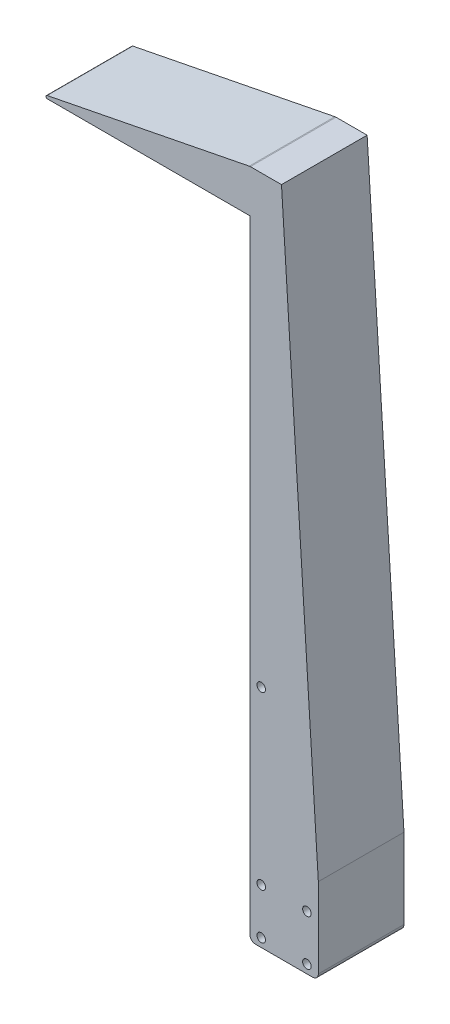
ISO-10303-21;
HEADER;
FILE_DESCRIPTION(('STEP AP214'),'2;1');
FILE_NAME('part.step','',(''),(''),'','','');
FILE_SCHEMA(('AUTOMOTIVE_DESIGN { 1 0 10303 214 1 1 1 1 }'));
ENDSEC;
DATA;
#1=APPLICATION_CONTEXT('core data for automotive mechanical design processes');
#2=APPLICATION_PROTOCOL_DEFINITION('international standard','automotive_design',2000,#1);
#3=PRODUCT_CONTEXT('',#1,'mechanical');
#4=PRODUCT('Part','Part','',(#3));
#5=PRODUCT_RELATED_PRODUCT_CATEGORY('part','',(#4));
#6=PRODUCT_DEFINITION_FORMATION('','',#4);
#7=PRODUCT_DEFINITION_CONTEXT('part definition',#1,'design');
#8=PRODUCT_DEFINITION('design','',#6,#7);
#9=PRODUCT_DEFINITION_SHAPE('','',#8);
#10=(LENGTH_UNIT() NAMED_UNIT(*) SI_UNIT(.MILLI.,.METRE.));
#11=(NAMED_UNIT(*) PLANE_ANGLE_UNIT() SI_UNIT($,.RADIAN.));
#12=(NAMED_UNIT(*) SI_UNIT($,.STERADIAN.) SOLID_ANGLE_UNIT());
#13=UNCERTAINTY_MEASURE_WITH_UNIT(LENGTH_MEASURE(1.E-05),#10,'distance_accuracy_value','');
#14=(GEOMETRIC_REPRESENTATION_CONTEXT(3) GLOBAL_UNCERTAINTY_ASSIGNED_CONTEXT((#13)) GLOBAL_UNIT_ASSIGNED_CONTEXT((#10,
#11,#12)) REPRESENTATION_CONTEXT('',''));
#15=CARTESIAN_POINT('',(0.,0.,0.));
#16=DIRECTION('',(0.,0.,1.));
#17=DIRECTION('',(1.,0.,0.));
#18=AXIS2_PLACEMENT_3D('',#15,#16,#17);
#19=CARTESIAN_POINT('',(22.,233.,30.));
#20=DIRECTION('',(0.,0.,1.));
#21=DIRECTION('',(1.,0.,0.));
#22=AXIS2_PLACEMENT_3D('',#19,#20,#21);
#23=PLANE('',#22);
#24=CARTESIAN_POINT('',(3.99999999999996,78.9999999999997,30.));
#25=DIRECTION('',(0.,0.,-1.));
#26=DIRECTION('',(-1.,0.,0.));
#27=AXIS2_PLACEMENT_3D('',#24,#25,#26);
#28=CIRCLE('',#27,1.5);
#29=CARTESIAN_POINT('',(2.49999999999996,78.9999999999997,30.));
#30=VERTEX_POINT('',#29);
#31=EDGE_CURVE('E258',#30,#30,#28,.T.);
#32=ORIENTED_EDGE('',*,*,#31,.T.);
#33=EDGE_LOOP('',(#32));
#34=FACE_BOUND('',#33,.T.);
#35=CARTESIAN_POINT('',(19.9999999999999,19.,30.));
#36=DIRECTION('',(0.,0.,1.));
#37=DIRECTION('',(1.,0.,0.));
#38=AXIS2_PLACEMENT_3D('',#35,#36,#37);
#39=CIRCLE('',#38,1.5);
#40=CARTESIAN_POINT('',(21.4999999999999,19.,30.));
#41=VERTEX_POINT('',#40);
#42=EDGE_CURVE('E242',#41,#41,#39,.T.);
#43=ORIENTED_EDGE('',*,*,#42,.F.);
#44=EDGE_LOOP('',(#43));
#45=FACE_BOUND('',#44,.T.);
#46=CARTESIAN_POINT('',(4.,2.99999999999989,30.));
#47=DIRECTION('',(0.,0.,1.));
#48=DIRECTION('',(1.,0.,0.));
#49=AXIS2_PLACEMENT_3D('',#46,#47,#48);
#50=CIRCLE('',#49,1.5);
#51=CARTESIAN_POINT('',(5.5,2.99999999999989,30.));
#52=VERTEX_POINT('',#51);
#53=EDGE_CURVE('E227',#52,#52,#50,.T.);
#54=ORIENTED_EDGE('',*,*,#53,.F.);
#55=EDGE_LOOP('',(#54));
#56=FACE_BOUND('',#55,.T.);
#57=CARTESIAN_POINT('',(20.,3.,30.));
#58=DIRECTION('',(0.,0.,1.));
#59=DIRECTION('',(1.,0.,0.));
#60=AXIS2_PLACEMENT_3D('',#57,#58,#59);
#61=CIRCLE('',#60,1.5);
#62=CARTESIAN_POINT('',(21.5,3.,30.));
#63=VERTEX_POINT('',#62);
#64=EDGE_CURVE('E161',#63,#63,#61,.T.);
#65=ORIENTED_EDGE('',*,*,#64,.F.);
#66=EDGE_LOOP('',(#65));
#67=FACE_BOUND('',#66,.T.);
#68=CARTESIAN_POINT('',(3.99999999999994,18.9999999999999,30.));
#69=DIRECTION('',(0.,0.,1.));
#70=DIRECTION('',(1.,0.,0.));
#71=AXIS2_PLACEMENT_3D('',#68,#69,#70);
#72=CIRCLE('',#71,1.5);
#73=CARTESIAN_POINT('',(5.49999999999995,18.9999999999999,30.));
#74=VERTEX_POINT('',#73);
#75=EDGE_CURVE('E231',#74,#74,#72,.T.);
#76=ORIENTED_EDGE('',*,*,#75,.F.);
#77=EDGE_LOOP('',(#76));
#78=FACE_BOUND('',#77,.T.);
#79=DIRECTION('',(0.,1.,0.));
#80=VECTOR('',#79,1.);
#81=CARTESIAN_POINT('',(24.,220.,30.));
#82=LINE('',#81,#80);
#83=CARTESIAN_POINT('',(24.,2.00000000000001,30.));
#84=VERTEX_POINT('',#83);
#85=CARTESIAN_POINT('',(24.,30.,30.));
#86=VERTEX_POINT('',#85);
#87=EDGE_CURVE('E65',#84,#86,#82,.T.);
#88=ORIENTED_EDGE('',*,*,#87,.T.);
#89=DIRECTION('',(-0.0628135619036731,0.998025278457902,0.));
#90=VECTOR('',#89,1.);
#91=CARTESIAN_POINT('',(24.,30.,30.));
#92=LINE('',#91,#90);
#93=CARTESIAN_POINT('',(11.0977414418305,235.,30.));
#94=VERTEX_POINT('',#93);
#95=EDGE_CURVE('E57',#86,#94,#92,.T.);
#96=ORIENTED_EDGE('',*,*,#95,.T.);
#97=DIRECTION('',(-1.,0.,0.));
#98=VECTOR('',#97,1.);
#99=CARTESIAN_POINT('',(22.,235.,30.));
#100=LINE('',#99,#98);
#101=CARTESIAN_POINT('',(0.195482883660973,235.,30.));
#102=VERTEX_POINT('',#101);
#103=EDGE_CURVE('E108',#94,#102,#100,.T.);
#104=ORIENTED_EDGE('',*,*,#103,.T.);
#105=CARTESIAN_POINT('',(0.195482883660966,233.,30.));
#106=DIRECTION('',(0.,0.,1.));
#107=DIRECTION('',(-1.,0.,0.));
#108=AXIS2_PLACEMENT_3D('',#105,#106,#107);
#109=CIRCLE('',#108,2.);
#110=CARTESIAN_POINT('',(-0.191783180132361,234.962148056553,30.));
#111=VERTEX_POINT('',#110);
#112=EDGE_CURVE('E222',#102,#111,#109,.T.);
#113=ORIENTED_EDGE('',*,*,#112,.T.);
#114=DIRECTION('',(-0.981074028276412,-0.19363303189666,0.));
#115=VECTOR('',#114,1.);
#116=CARTESIAN_POINT('',(-0.191783180132361,234.962148056553,30.));
#117=LINE('',#116,#115);
#118=CARTESIAN_POINT('',(-70.9812791283662,220.990537014138,30.));
#119=VERTEX_POINT('',#118);
#120=EDGE_CURVE('E198',#111,#119,#117,.T.);
#121=ORIENTED_EDGE('',*,*,#120,.T.);
#122=CARTESIAN_POINT('',(-70.8844626124181,220.5,30.));
#123=DIRECTION('',(0.,0.,1.));
#124=DIRECTION('',(-1.,0.,0.));
#125=AXIS2_PLACEMENT_3D('',#122,#123,#124);
#126=CIRCLE('',#125,0.499999999999995);
#127=CARTESIAN_POINT('',(-70.8844626124179,220.,30.));
#128=VERTEX_POINT('',#127);
#129=EDGE_CURVE('E216',#119,#128,#126,.T.);
#130=ORIENTED_EDGE('',*,*,#129,.T.);
#131=DIRECTION('',(1.,0.,0.));
#132=VECTOR('',#131,1.);
#133=CARTESIAN_POINT('',(0.,220.,30.));
#134=LINE('',#133,#132);
#135=CARTESIAN_POINT('',(0.,220.,30.));
#136=VERTEX_POINT('',#135);
#137=EDGE_CURVE('E214',#128,#136,#134,.T.);
#138=ORIENTED_EDGE('',*,*,#137,.T.);
#139=DIRECTION('',(0.,-1.,0.));
#140=VECTOR('',#139,1.);
#141=CARTESIAN_POINT('',(0.,2.00000000000001,30.));
#142=LINE('',#141,#140);
#143=CARTESIAN_POINT('',(0.,2.,30.));
#144=VERTEX_POINT('',#143);
#145=EDGE_CURVE('E131',#136,#144,#142,.T.);
#146=ORIENTED_EDGE('',*,*,#145,.T.);
#147=CARTESIAN_POINT('',(2.,2.,30.));
#148=DIRECTION('',(0.,0.,1.));
#149=DIRECTION('',(-1.,0.,0.));
#150=AXIS2_PLACEMENT_3D('',#147,#148,#149);
#151=CIRCLE('',#150,2.);
#152=CARTESIAN_POINT('',(2.00000000000001,0.,30.));
#153=VERTEX_POINT('',#152);
#154=EDGE_CURVE('E129',#144,#153,#151,.T.);
#155=ORIENTED_EDGE('',*,*,#154,.T.);
#156=DIRECTION('',(1.,0.,0.));
#157=VECTOR('',#156,1.);
#158=CARTESIAN_POINT('',(2.00000000000001,0.,30.));
#159=LINE('',#158,#157);
#160=CARTESIAN_POINT('',(22.,0.,30.));
#161=VERTEX_POINT('',#160);
#162=EDGE_CURVE('E134',#153,#161,#159,.T.);
#163=ORIENTED_EDGE('',*,*,#162,.T.);
#164=CARTESIAN_POINT('',(22.,2.,30.));
#165=DIRECTION('',(0.,0.,1.));
#166=DIRECTION('',(1.,0.,0.));
#167=AXIS2_PLACEMENT_3D('',#164,#165,#166);
#168=CIRCLE('',#167,2.);
#169=EDGE_CURVE('E155',#161,#84,#168,.T.);
#170=ORIENTED_EDGE('',*,*,#169,.T.);
#171=EDGE_LOOP('',(#88,#96,#104,#113,#121,#130,#138,#146,#155,#163,#170));
#172=FACE_BOUND('',#171,.T.);
#173=ADVANCED_FACE('F41',(#34,#45,#56,#67,#78,#172),#23,.T.);
#174=CARTESIAN_POINT('',(22.,233.,0.));
#175=DIRECTION('',(0.,0.,1.));
#176=DIRECTION('',(1.,0.,0.));
#177=AXIS2_PLACEMENT_3D('',#174,#175,#176);
#178=PLANE('',#177);
#179=CARTESIAN_POINT('',(3.99999999999996,78.9999999999997,0.));
#180=DIRECTION('',(0.,0.,-1.));
#181=DIRECTION('',(-1.,0.,0.));
#182=AXIS2_PLACEMENT_3D('',#179,#180,#181);
#183=CIRCLE('',#182,1.5);
#184=CARTESIAN_POINT('',(2.49999999999996,78.9999999999997,0.));
#185=VERTEX_POINT('',#184);
#186=EDGE_CURVE('E256',#185,#185,#183,.T.);
#187=ORIENTED_EDGE('',*,*,#186,.F.);
#188=EDGE_LOOP('',(#187));
#189=FACE_BOUND('',#188,.T.);
#190=CARTESIAN_POINT('',(3.99999999999994,18.9999999999999,0.));
#191=DIRECTION('',(0.,0.,1.));
#192=DIRECTION('',(1.,0.,0.));
#193=AXIS2_PLACEMENT_3D('',#190,#191,#192);
#194=CIRCLE('',#193,1.5);
#195=CARTESIAN_POINT('',(5.49999999999995,18.9999999999999,0.));
#196=VERTEX_POINT('',#195);
#197=EDGE_CURVE('E240',#196,#196,#194,.T.);
#198=ORIENTED_EDGE('',*,*,#197,.T.);
#199=EDGE_LOOP('',(#198));
#200=FACE_BOUND('',#199,.T.);
#201=CARTESIAN_POINT('',(4.,2.99999999999989,0.));
#202=DIRECTION('',(0.,0.,1.));
#203=DIRECTION('',(1.,0.,0.));
#204=AXIS2_PLACEMENT_3D('',#201,#202,#203);
#205=CIRCLE('',#204,1.5);
#206=CARTESIAN_POINT('',(5.5,2.99999999999989,0.));
#207=VERTEX_POINT('',#206);
#208=EDGE_CURVE('E232',#207,#207,#205,.T.);
#209=ORIENTED_EDGE('',*,*,#208,.T.);
#210=EDGE_LOOP('',(#209));
#211=FACE_BOUND('',#210,.T.);
#212=CARTESIAN_POINT('',(20.,3.,0.));
#213=DIRECTION('',(0.,0.,1.));
#214=DIRECTION('',(1.,0.,0.));
#215=AXIS2_PLACEMENT_3D('',#212,#213,#214);
#216=CIRCLE('',#215,1.5);
#217=CARTESIAN_POINT('',(21.5,3.,0.));
#218=VERTEX_POINT('',#217);
#219=EDGE_CURVE('E223',#218,#218,#216,.T.);
#220=ORIENTED_EDGE('',*,*,#219,.T.);
#221=EDGE_LOOP('',(#220));
#222=FACE_BOUND('',#221,.T.);
#223=CARTESIAN_POINT('',(19.9999999999999,19.,0.));
#224=DIRECTION('',(0.,0.,1.));
#225=DIRECTION('',(1.,0.,0.));
#226=AXIS2_PLACEMENT_3D('',#223,#224,#225);
#227=CIRCLE('',#226,1.5);
#228=CARTESIAN_POINT('',(21.4999999999999,19.,0.));
#229=VERTEX_POINT('',#228);
#230=EDGE_CURVE('E238',#229,#229,#227,.T.);
#231=ORIENTED_EDGE('',*,*,#230,.T.);
#232=EDGE_LOOP('',(#231));
#233=FACE_BOUND('',#232,.T.);
#234=DIRECTION('',(-0.0628135619036731,0.998025278457902,0.));
#235=VECTOR('',#234,1.);
#236=CARTESIAN_POINT('',(24.,30.,0.));
#237=LINE('',#236,#235);
#238=CARTESIAN_POINT('',(24.,30.,0.));
#239=VERTEX_POINT('',#238);
#240=CARTESIAN_POINT('',(11.0977414418305,235.,0.));
#241=VERTEX_POINT('',#240);
#242=EDGE_CURVE('E251',#239,#241,#237,.T.);
#243=ORIENTED_EDGE('',*,*,#242,.F.);
#244=DIRECTION('',(0.,1.,0.));
#245=VECTOR('',#244,1.);
#246=CARTESIAN_POINT('',(24.,2.00000000000001,0.));
#247=LINE('',#246,#245);
#248=CARTESIAN_POINT('',(24.,2.00000000000001,0.));
#249=VERTEX_POINT('',#248);
#250=EDGE_CURVE('E171',#249,#239,#247,.T.);
#251=ORIENTED_EDGE('',*,*,#250,.F.);
#252=CARTESIAN_POINT('',(22.,2.,0.));
#253=DIRECTION('',(0.,0.,1.));
#254=DIRECTION('',(1.,0.,0.));
#255=AXIS2_PLACEMENT_3D('',#252,#253,#254);
#256=CIRCLE('',#255,2.);
#257=CARTESIAN_POINT('',(22.,0.,0.));
#258=VERTEX_POINT('',#257);
#259=EDGE_CURVE('E105',#258,#249,#256,.T.);
#260=ORIENTED_EDGE('',*,*,#259,.F.);
#261=DIRECTION('',(1.,0.,0.));
#262=VECTOR('',#261,1.);
#263=CARTESIAN_POINT('',(2.00000000000001,0.,0.));
#264=LINE('',#263,#262);
#265=CARTESIAN_POINT('',(2.00000000000001,0.,0.));
#266=VERTEX_POINT('',#265);
#267=EDGE_CURVE('E174',#266,#258,#264,.T.);
#268=ORIENTED_EDGE('',*,*,#267,.F.);
#269=CARTESIAN_POINT('',(2.,2.,0.));
#270=DIRECTION('',(0.,0.,1.));
#271=DIRECTION('',(-1.,0.,0.));
#272=AXIS2_PLACEMENT_3D('',#269,#270,#271);
#273=CIRCLE('',#272,2.);
#274=CARTESIAN_POINT('',(0.,2.,0.));
#275=VERTEX_POINT('',#274);
#276=EDGE_CURVE('E145',#275,#266,#273,.T.);
#277=ORIENTED_EDGE('',*,*,#276,.F.);
#278=DIRECTION('',(0.,-1.,0.));
#279=VECTOR('',#278,1.);
#280=CARTESIAN_POINT('',(0.,2.00000000000001,0.));
#281=LINE('',#280,#279);
#282=CARTESIAN_POINT('',(0.,220.,0.));
#283=VERTEX_POINT('',#282);
#284=EDGE_CURVE('E166',#283,#275,#281,.T.);
#285=ORIENTED_EDGE('',*,*,#284,.F.);
#286=DIRECTION('',(1.,0.,0.));
#287=VECTOR('',#286,1.);
#288=CARTESIAN_POINT('',(0.,220.,0.));
#289=LINE('',#288,#287);
#290=CARTESIAN_POINT('',(-70.8844626124179,220.,0.));
#291=VERTEX_POINT('',#290);
#292=EDGE_CURVE('E170',#291,#283,#289,.T.);
#293=ORIENTED_EDGE('',*,*,#292,.F.);
#294=CARTESIAN_POINT('',(-70.8844626124181,220.5,0.));
#295=DIRECTION('',(0.,0.,1.));
#296=DIRECTION('',(-1.,0.,0.));
#297=AXIS2_PLACEMENT_3D('',#294,#295,#296);
#298=CIRCLE('',#297,0.499999999999995);
#299=CARTESIAN_POINT('',(-70.9812791283662,220.990537014138,0.));
#300=VERTEX_POINT('',#299);
#301=EDGE_CURVE('E164',#300,#291,#298,.T.);
#302=ORIENTED_EDGE('',*,*,#301,.F.);
#303=DIRECTION('',(-0.981074028276412,-0.19363303189666,0.));
#304=VECTOR('',#303,1.);
#305=CARTESIAN_POINT('',(-0.191783180132361,234.962148056553,0.));
#306=LINE('',#305,#304);
#307=CARTESIAN_POINT('',(-0.191783180132361,234.962148056553,0.));
#308=VERTEX_POINT('',#307);
#309=EDGE_CURVE('E162',#308,#300,#306,.T.);
#310=ORIENTED_EDGE('',*,*,#309,.F.);
#311=CARTESIAN_POINT('',(0.195482883660966,233.,0.));
#312=DIRECTION('',(0.,0.,1.));
#313=DIRECTION('',(-1.,0.,0.));
#314=AXIS2_PLACEMENT_3D('',#311,#312,#313);
#315=CIRCLE('',#314,2.);
#316=CARTESIAN_POINT('',(0.195482883660973,235.,0.));
#317=VERTEX_POINT('',#316);
#318=EDGE_CURVE('E159',#317,#308,#315,.T.);
#319=ORIENTED_EDGE('',*,*,#318,.F.);
#320=DIRECTION('',(-1.,0.,0.));
#321=VECTOR('',#320,1.);
#322=CARTESIAN_POINT('',(22.,235.,0.));
#323=LINE('',#322,#321);
#324=EDGE_CURVE('E158',#241,#317,#323,.T.);
#325=ORIENTED_EDGE('',*,*,#324,.F.);
#326=EDGE_LOOP('',(#243,#251,#260,#268,#277,#285,#293,#302,#310,#319,#325));
#327=FACE_BOUND('',#326,.T.);
#328=ADVANCED_FACE('F201',(#189,#200,#211,#222,#233,#327),#178,.F.);
#329=CARTESIAN_POINT('',(22.,235.,30.));
#330=DIRECTION('',(0.,-1.,0.));
#331=DIRECTION('',(0.,0.,-1.));
#332=AXIS2_PLACEMENT_3D('',#329,#330,#331);
#333=PLANE('',#332);
#334=ORIENTED_EDGE('',*,*,#103,.F.);
#335=DIRECTION('',(0.,0.,-1.));
#336=VECTOR('',#335,1.);
#337=CARTESIAN_POINT('',(11.0977414418305,235.,30.));
#338=LINE('',#337,#336);
#339=EDGE_CURVE('E247',#94,#241,#338,.T.);
#340=ORIENTED_EDGE('',*,*,#339,.T.);
#341=ORIENTED_EDGE('',*,*,#324,.T.);
#342=DIRECTION('',(0.,0.,-1.));
#343=VECTOR('',#342,1.);
#344=CARTESIAN_POINT('',(0.195482883660973,235.,30.));
#345=LINE('',#344,#343);
#346=EDGE_CURVE('E11',#102,#317,#345,.T.);
#347=ORIENTED_EDGE('',*,*,#346,.F.);
#348=EDGE_LOOP('',(#334,#340,#341,#347));
#349=FACE_BOUND('',#348,.T.);
#350=ADVANCED_FACE('F43',(#349),#333,.F.);
#351=CARTESIAN_POINT('',(0.195482883660966,233.,30.));
#352=DIRECTION('',(0.,0.,-1.));
#353=DIRECTION('',(-1.,0.,0.));
#354=AXIS2_PLACEMENT_3D('',#351,#352,#353);
#355=CYLINDRICAL_SURFACE('',#354,2.);
#356=ORIENTED_EDGE('',*,*,#318,.T.);
#357=DIRECTION('',(0.,0.,-1.));
#358=VECTOR('',#357,1.);
#359=CARTESIAN_POINT('',(-0.191783180132361,234.962148056553,30.));
#360=LINE('',#359,#358);
#361=EDGE_CURVE('E47',#111,#308,#360,.T.);
#362=ORIENTED_EDGE('',*,*,#361,.F.);
#363=ORIENTED_EDGE('',*,*,#112,.F.);
#364=ORIENTED_EDGE('',*,*,#346,.T.);
#365=EDGE_LOOP('',(#356,#362,#363,#364));
#366=FACE_BOUND('',#365,.T.);
#367=ADVANCED_FACE('F334',(#366),#355,.T.);
#368=CARTESIAN_POINT('',(-0.191783180132361,234.962148056553,30.));
#369=DIRECTION('',(0.19363303189666,-0.981074028276412,0.));
#370=DIRECTION('',(0.981074028276413,0.19363303189666,0.));
#371=AXIS2_PLACEMENT_3D('',#368,#369,#370);
#372=PLANE('',#371);
#373=ORIENTED_EDGE('',*,*,#309,.T.);
#374=DIRECTION('',(0.,0.,-1.));
#375=VECTOR('',#374,1.);
#376=CARTESIAN_POINT('',(-70.9812791283662,220.990537014138,30.));
#377=LINE('',#376,#375);
#378=EDGE_CURVE('E189',#119,#300,#377,.T.);
#379=ORIENTED_EDGE('',*,*,#378,.F.);
#380=ORIENTED_EDGE('',*,*,#120,.F.);
#381=ORIENTED_EDGE('',*,*,#361,.T.);
#382=EDGE_LOOP('',(#373,#379,#380,#381));
#383=FACE_BOUND('',#382,.T.);
#384=ADVANCED_FACE('F191',(#383),#372,.F.);
#385=CARTESIAN_POINT('',(-70.8844626124181,220.5,30.));
#386=DIRECTION('',(0.,0.,-1.));
#387=DIRECTION('',(-1.,0.,0.));
#388=AXIS2_PLACEMENT_3D('',#385,#386,#387);
#389=CYLINDRICAL_SURFACE('',#388,0.499999999999995);
#390=ORIENTED_EDGE('',*,*,#301,.T.);
#391=DIRECTION('',(0.,0.,-1.));
#392=VECTOR('',#391,1.);
#393=CARTESIAN_POINT('',(-70.8844626124179,220.,30.));
#394=LINE('',#393,#392);
#395=EDGE_CURVE('E184',#128,#291,#394,.T.);
#396=ORIENTED_EDGE('',*,*,#395,.F.);
#397=ORIENTED_EDGE('',*,*,#129,.F.);
#398=ORIENTED_EDGE('',*,*,#378,.T.);
#399=EDGE_LOOP('',(#390,#396,#397,#398));
#400=FACE_BOUND('',#399,.T.);
#401=ADVANCED_FACE('F207',(#400),#389,.T.);
#402=CARTESIAN_POINT('',(0.,220.,30.));
#403=DIRECTION('',(0.,1.,0.));
#404=DIRECTION('',(0.,0.,1.));
#405=AXIS2_PLACEMENT_3D('',#402,#403,#404);
#406=PLANE('',#405);
#407=ORIENTED_EDGE('',*,*,#292,.T.);
#408=DIRECTION('',(0.,0.,-1.));
#409=VECTOR('',#408,1.);
#410=CARTESIAN_POINT('',(0.,220.,30.));
#411=LINE('',#410,#409);
#412=EDGE_CURVE('E182',#136,#283,#411,.T.);
#413=ORIENTED_EDGE('',*,*,#412,.F.);
#414=ORIENTED_EDGE('',*,*,#137,.F.);
#415=ORIENTED_EDGE('',*,*,#395,.T.);
#416=EDGE_LOOP('',(#407,#413,#414,#415));
#417=FACE_BOUND('',#416,.T.);
#418=ADVANCED_FACE('F213',(#417),#406,.F.);
#419=CARTESIAN_POINT('',(0.,2.00000000000001,30.));
#420=DIRECTION('',(1.,0.,0.));
#421=DIRECTION('',(0.,0.,-1.));
#422=AXIS2_PLACEMENT_3D('',#419,#420,#421);
#423=PLANE('',#422);
#424=ORIENTED_EDGE('',*,*,#284,.T.);
#425=DIRECTION('',(0.,0.,-1.));
#426=VECTOR('',#425,1.);
#427=CARTESIAN_POINT('',(0.,2.,30.));
#428=LINE('',#427,#426);
#429=EDGE_CURVE('E150',#144,#275,#428,.T.);
#430=ORIENTED_EDGE('',*,*,#429,.F.);
#431=ORIENTED_EDGE('',*,*,#145,.F.);
#432=ORIENTED_EDGE('',*,*,#412,.T.);
#433=EDGE_LOOP('',(#424,#430,#431,#432));
#434=FACE_BOUND('',#433,.T.);
#435=ADVANCED_FACE('F322',(#434),#423,.F.);
#436=CARTESIAN_POINT('',(2.,2.,30.));
#437=DIRECTION('',(0.,0.,-1.));
#438=DIRECTION('',(-1.,0.,0.));
#439=AXIS2_PLACEMENT_3D('',#436,#437,#438);
#440=CYLINDRICAL_SURFACE('',#439,2.);
#441=ORIENTED_EDGE('',*,*,#276,.T.);
#442=DIRECTION('',(0.,0.,-1.));
#443=VECTOR('',#442,1.);
#444=CARTESIAN_POINT('',(2.00000000000001,0.,30.));
#445=LINE('',#444,#443);
#446=EDGE_CURVE('E143',#153,#266,#445,.T.);
#447=ORIENTED_EDGE('',*,*,#446,.F.);
#448=ORIENTED_EDGE('',*,*,#154,.F.);
#449=ORIENTED_EDGE('',*,*,#429,.T.);
#450=EDGE_LOOP('',(#441,#447,#448,#449));
#451=FACE_BOUND('',#450,.T.);
#452=ADVANCED_FACE('F142',(#451),#440,.T.);
#453=CARTESIAN_POINT('',(2.00000000000001,0.,30.));
#454=DIRECTION('',(0.,1.,0.));
#455=DIRECTION('',(0.,0.,1.));
#456=AXIS2_PLACEMENT_3D('',#453,#454,#455);
#457=PLANE('',#456);
#458=ORIENTED_EDGE('',*,*,#267,.T.);
#459=DIRECTION('',(0.,0.,-1.));
#460=VECTOR('',#459,1.);
#461=CARTESIAN_POINT('',(22.,0.,30.));
#462=LINE('',#461,#460);
#463=EDGE_CURVE('E146',#161,#258,#462,.T.);
#464=ORIENTED_EDGE('',*,*,#463,.F.);
#465=ORIENTED_EDGE('',*,*,#162,.F.);
#466=ORIENTED_EDGE('',*,*,#446,.T.);
#467=EDGE_LOOP('',(#458,#464,#465,#466));
#468=FACE_BOUND('',#467,.T.);
#469=ADVANCED_FACE('F147',(#468),#457,.F.);
#470=CARTESIAN_POINT('',(22.,2.,30.));
#471=DIRECTION('',(0.,0.,-1.));
#472=DIRECTION('',(-1.,0.,0.));
#473=AXIS2_PLACEMENT_3D('',#470,#471,#472);
#474=CYLINDRICAL_SURFACE('',#473,2.);
#475=ORIENTED_EDGE('',*,*,#259,.T.);
#476=DIRECTION('',(0.,0.,-1.));
#477=VECTOR('',#476,1.);
#478=CARTESIAN_POINT('',(24.,2.00000000000001,30.));
#479=LINE('',#478,#477);
#480=EDGE_CURVE('E152',#84,#249,#479,.T.);
#481=ORIENTED_EDGE('',*,*,#480,.F.);
#482=ORIENTED_EDGE('',*,*,#169,.F.);
#483=ORIENTED_EDGE('',*,*,#463,.T.);
#484=EDGE_LOOP('',(#475,#481,#482,#483));
#485=FACE_BOUND('',#484,.T.);
#486=ADVANCED_FACE('F320',(#485),#474,.T.);
#487=CARTESIAN_POINT('',(24.,2.00000000000001,30.));
#488=DIRECTION('',(-1.,0.,0.));
#489=DIRECTION('',(0.,0.,1.));
#490=AXIS2_PLACEMENT_3D('',#487,#488,#489);
#491=PLANE('',#490);
#492=ORIENTED_EDGE('',*,*,#250,.T.);
#493=DIRECTION('',(0.,0.,-1.));
#494=VECTOR('',#493,1.);
#495=CARTESIAN_POINT('',(24.,30.,30.));
#496=LINE('',#495,#494);
#497=EDGE_CURVE('E246',#86,#239,#496,.T.);
#498=ORIENTED_EDGE('',*,*,#497,.F.);
#499=ORIENTED_EDGE('',*,*,#87,.F.);
#500=ORIENTED_EDGE('',*,*,#480,.T.);
#501=EDGE_LOOP('',(#492,#498,#499,#500));
#502=FACE_BOUND('',#501,.T.);
#503=ADVANCED_FACE('F315',(#502),#491,.F.);
#504=CARTESIAN_POINT('',(20.,3.,30.));
#505=DIRECTION('',(0.,0.,-1.));
#506=DIRECTION('',(-1.,0.,0.));
#507=AXIS2_PLACEMENT_3D('',#504,#505,#506);
#508=CYLINDRICAL_SURFACE('',#507,1.5);
#509=ORIENTED_EDGE('',*,*,#64,.T.);
#510=EDGE_LOOP('',(#509));
#511=FACE_BOUND('',#510,.T.);
#512=ORIENTED_EDGE('',*,*,#219,.F.);
#513=EDGE_LOOP('',(#512));
#514=FACE_BOUND('',#513,.T.);
#515=ADVANCED_FACE('F308',(#511,#514),#508,.F.);
#516=CARTESIAN_POINT('',(4.,2.99999999999989,30.));
#517=DIRECTION('',(0.,0.,-1.));
#518=DIRECTION('',(-1.,0.,0.));
#519=AXIS2_PLACEMENT_3D('',#516,#517,#518);
#520=CYLINDRICAL_SURFACE('',#519,1.5);
#521=ORIENTED_EDGE('',*,*,#53,.T.);
#522=EDGE_LOOP('',(#521));
#523=FACE_BOUND('',#522,.T.);
#524=ORIENTED_EDGE('',*,*,#208,.F.);
#525=EDGE_LOOP('',(#524));
#526=FACE_BOUND('',#525,.T.);
#527=ADVANCED_FACE('F302',(#523,#526),#520,.F.);
#528=CARTESIAN_POINT('',(3.99999999999994,18.9999999999999,30.));
#529=DIRECTION('',(0.,0.,-1.));
#530=DIRECTION('',(-1.,0.,0.));
#531=AXIS2_PLACEMENT_3D('',#528,#529,#530);
#532=CYLINDRICAL_SURFACE('',#531,1.5);
#533=ORIENTED_EDGE('',*,*,#75,.T.);
#534=EDGE_LOOP('',(#533));
#535=FACE_BOUND('',#534,.T.);
#536=ORIENTED_EDGE('',*,*,#197,.F.);
#537=EDGE_LOOP('',(#536));
#538=FACE_BOUND('',#537,.T.);
#539=ADVANCED_FACE('F289',(#535,#538),#532,.F.);
#540=CARTESIAN_POINT('',(19.9999999999999,19.,0.));
#541=DIRECTION('',(0.,0.,1.));
#542=DIRECTION('',(1.,0.,0.));
#543=AXIS2_PLACEMENT_3D('',#540,#541,#542);
#544=CYLINDRICAL_SURFACE('',#543,1.5);
#545=ORIENTED_EDGE('',*,*,#230,.F.);
#546=EDGE_LOOP('',(#545));
#547=FACE_BOUND('',#546,.T.);
#548=ORIENTED_EDGE('',*,*,#42,.T.);
#549=EDGE_LOOP('',(#548));
#550=FACE_BOUND('',#549,.T.);
#551=ADVANCED_FACE('F285',(#547,#550),#544,.F.);
#552=CARTESIAN_POINT('',(24.,30.,30.));
#553=DIRECTION('',(-0.998025278457902,-0.0628135619036731,0.));
#554=DIRECTION('',(0.0628135619036731,-0.998025278457902,0.));
#555=AXIS2_PLACEMENT_3D('',#552,#553,#554);
#556=PLANE('',#555);
#557=ORIENTED_EDGE('',*,*,#242,.T.);
#558=ORIENTED_EDGE('',*,*,#339,.F.);
#559=ORIENTED_EDGE('',*,*,#95,.F.);
#560=ORIENTED_EDGE('',*,*,#497,.T.);
#561=EDGE_LOOP('',(#557,#558,#559,#560));
#562=FACE_BOUND('',#561,.T.);
#563=ADVANCED_FACE('F267',(#562),#556,.F.);
#564=CARTESIAN_POINT('',(3.99999999999996,78.9999999999997,30.));
#565=DIRECTION('',(0.,0.,-1.));
#566=DIRECTION('',(-1.,0.,0.));
#567=AXIS2_PLACEMENT_3D('',#564,#565,#566);
#568=CYLINDRICAL_SURFACE('',#567,1.5);
#569=ORIENTED_EDGE('',*,*,#31,.F.);
#570=EDGE_LOOP('',(#569));
#571=FACE_BOUND('',#570,.T.);
#572=ORIENTED_EDGE('',*,*,#186,.T.);
#573=EDGE_LOOP('',(#572));
#574=FACE_BOUND('',#573,.T.);
#575=ADVANCED_FACE('F266',(#571,#574),#568,.F.);
#576=CLOSED_SHELL('',(#173,#328,#350,#367,#384,#401,#418,#435,#452,#469,#486,#503,#515,#527,
#539,#551,#563,#575));
#577=MANIFOLD_SOLID_BREP('B2',#576);
#578=ADVANCED_BREP_SHAPE_REPRESENTATION('',(#18,#577),#14);
#579=SHAPE_DEFINITION_REPRESENTATION(#9,#578);
ENDSEC;
END-ISO-10303-21;
